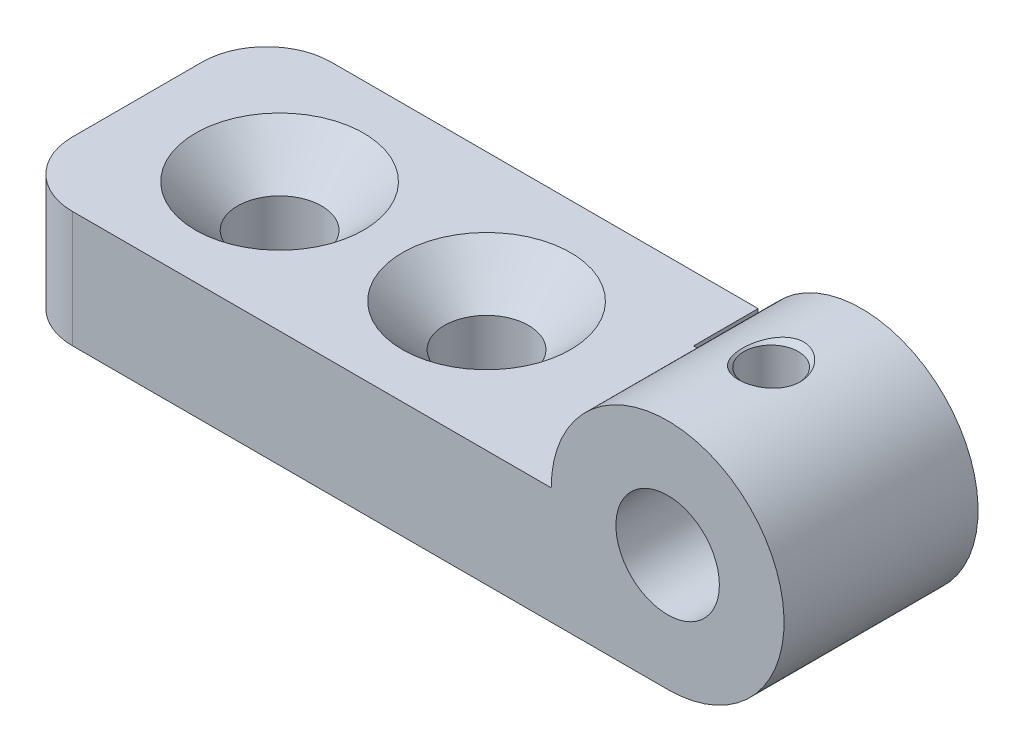
ISO-10303-21;
HEADER;
FILE_DESCRIPTION(('STEP AP214'),'2;1');
FILE_NAME('part.step','',(''),(''),'','','');
FILE_SCHEMA(('AUTOMOTIVE_DESIGN { 1 0 10303 214 1 1 1 1 }'));
ENDSEC;
DATA;
#1=APPLICATION_CONTEXT('core data for automotive mechanical design processes');
#2=APPLICATION_PROTOCOL_DEFINITION('international standard','automotive_design',2000,#1);
#3=PRODUCT_CONTEXT('',#1,'mechanical');
#4=PRODUCT('Part','Part','',(#3));
#5=PRODUCT_RELATED_PRODUCT_CATEGORY('part','',(#4));
#6=PRODUCT_DEFINITION_FORMATION('','',#4);
#7=PRODUCT_DEFINITION_CONTEXT('part definition',#1,'design');
#8=PRODUCT_DEFINITION('design','',#6,#7);
#9=PRODUCT_DEFINITION_SHAPE('','',#8);
#10=(LENGTH_UNIT() NAMED_UNIT(*) SI_UNIT(.MILLI.,.METRE.));
#11=(NAMED_UNIT(*) PLANE_ANGLE_UNIT() SI_UNIT($,.RADIAN.));
#12=(NAMED_UNIT(*) SI_UNIT($,.STERADIAN.) SOLID_ANGLE_UNIT());
#13=UNCERTAINTY_MEASURE_WITH_UNIT(LENGTH_MEASURE(1.E-05),#10,'distance_accuracy_value','');
#14=(GEOMETRIC_REPRESENTATION_CONTEXT(3) GLOBAL_UNCERTAINTY_ASSIGNED_CONTEXT((#13)) GLOBAL_UNIT_ASSIGNED_CONTEXT((#10,
#11,#12)) REPRESENTATION_CONTEXT('',''));
#15=CARTESIAN_POINT('',(0.,0.,0.));
#16=DIRECTION('',(0.,0.,1.));
#17=DIRECTION('',(1.,0.,0.));
#18=AXIS2_PLACEMENT_3D('',#15,#16,#17);
#19=CARTESIAN_POINT('',(51.,9.,10.));
#20=DIRECTION('',(0.,0.,1.));
#21=DIRECTION('',(1.,0.,0.));
#22=AXIS2_PLACEMENT_3D('',#19,#20,#21);
#23=PLANE('',#22);
#24=DIRECTION('',(-1.,0.,0.));
#25=VECTOR('',#24,1.);
#26=CARTESIAN_POINT('',(0.,9.,10.));
#27=LINE('',#26,#25);
#28=CARTESIAN_POINT('',(42.,9.,10.));
#29=VERTEX_POINT('',#28);
#30=CARTESIAN_POINT('',(5.,9.,10.));
#31=VERTEX_POINT('',#30);
#32=EDGE_CURVE('E157',#29,#31,#27,.T.);
#33=ORIENTED_EDGE('',*,*,#32,.T.);
#34=DIRECTION('',(0.,-1.,0.));
#35=VECTOR('',#34,1.);
#36=CARTESIAN_POINT('',(5.,0.,10.));
#37=LINE('',#36,#35);
#38=CARTESIAN_POINT('',(5.,0.,10.));
#39=VERTEX_POINT('',#38);
#40=EDGE_CURVE('E12',#31,#39,#37,.T.);
#41=ORIENTED_EDGE('',*,*,#40,.T.);
#42=DIRECTION('',(1.,0.,0.));
#43=VECTOR('',#42,1.);
#44=CARTESIAN_POINT('',(0.,0.,10.));
#45=LINE('',#44,#43);
#46=CARTESIAN_POINT('',(51.,0.,10.));
#47=VERTEX_POINT('',#46);
#48=EDGE_CURVE('E152',#39,#47,#45,.T.);
#49=ORIENTED_EDGE('',*,*,#48,.T.);
#50=CARTESIAN_POINT('',(51.,9.,10.));
#51=DIRECTION('',(0.,0.,1.));
#52=DIRECTION('',(1.,0.,0.));
#53=AXIS2_PLACEMENT_3D('',#50,#51,#52);
#54=CIRCLE('',#53,9.);
#55=EDGE_CURVE('E154',#47,#29,#54,.T.);
#56=ORIENTED_EDGE('',*,*,#55,.T.);
#57=EDGE_LOOP('',(#33,#41,#49,#56));
#58=FACE_BOUND('',#57,.T.);
#59=CARTESIAN_POINT('',(51.,9.,10.));
#60=DIRECTION('',(0.,0.,1.));
#61=DIRECTION('',(1.,0.,0.));
#62=AXIS2_PLACEMENT_3D('',#59,#60,#61);
#63=CIRCLE('',#62,4.);
#64=CARTESIAN_POINT('',(55.,9.,10.));
#65=VERTEX_POINT('',#64);
#66=EDGE_CURVE('E148',#65,#65,#63,.T.);
#67=ORIENTED_EDGE('',*,*,#66,.F.);
#68=EDGE_LOOP('',(#67));
#69=FACE_BOUND('',#68,.T.);
#70=ADVANCED_FACE('F47',(#58,#69),#23,.T.);
#71=CARTESIAN_POINT('',(51.,9.,-10.));
#72=DIRECTION('',(0.,0.,1.));
#73=DIRECTION('',(1.,0.,0.));
#74=AXIS2_PLACEMENT_3D('',#71,#72,#73);
#75=PLANE('',#74);
#76=DIRECTION('',(1.,0.,0.));
#77=VECTOR('',#76,1.);
#78=CARTESIAN_POINT('',(0.,0.,-10.));
#79=LINE('',#78,#77);
#80=CARTESIAN_POINT('',(5.,0.,-10.));
#81=VERTEX_POINT('',#80);
#82=CARTESIAN_POINT('',(38.,0.,-10.));
#83=VERTEX_POINT('',#82);
#84=EDGE_CURVE('E151',#81,#83,#79,.T.);
#85=ORIENTED_EDGE('',*,*,#84,.F.);
#86=DIRECTION('',(0.,-1.,0.));
#87=VECTOR('',#86,1.);
#88=CARTESIAN_POINT('',(5.,9.,-10.));
#89=LINE('',#88,#87);
#90=CARTESIAN_POINT('',(5.,9.,-10.));
#91=VERTEX_POINT('',#90);
#92=EDGE_CURVE('E70',#81,#91,#89,.F.);
#93=ORIENTED_EDGE('',*,*,#92,.T.);
#94=DIRECTION('',(-1.,0.,0.));
#95=VECTOR('',#94,1.);
#96=CARTESIAN_POINT('',(0.,9.,-10.));
#97=LINE('',#96,#95);
#98=CARTESIAN_POINT('',(38.,9.,-10.));
#99=VERTEX_POINT('',#98);
#100=EDGE_CURVE('E155',#99,#91,#97,.T.);
#101=ORIENTED_EDGE('',*,*,#100,.F.);
#102=DIRECTION('',(0.,-1.,0.));
#103=VECTOR('',#102,1.);
#104=CARTESIAN_POINT('',(38.,102.446411113868,-10.));
#105=LINE('',#104,#103);
#106=EDGE_CURVE('E123',#99,#83,#105,.T.);
#107=ORIENTED_EDGE('',*,*,#106,.T.);
#108=EDGE_LOOP('',(#85,#93,#101,#107));
#109=FACE_BOUND('',#108,.T.);
#110=ADVANCED_FACE('F253',(#109),#75,.F.);
#111=CARTESIAN_POINT('',(0.,0.,10.));
#112=DIRECTION('',(1.,0.,0.));
#113=DIRECTION('',(0.,0.,-1.));
#114=AXIS2_PLACEMENT_3D('',#111,#112,#113);
#115=PLANE('',#114);
#116=DIRECTION('',(0.,0.,-1.));
#117=VECTOR('',#116,1.);
#118=CARTESIAN_POINT('',(0.,9.,10.));
#119=LINE('',#118,#117);
#120=CARTESIAN_POINT('',(0.,9.,5.));
#121=VERTEX_POINT('',#120);
#122=CARTESIAN_POINT('',(0.,9.,-5.));
#123=VERTEX_POINT('',#122);
#124=EDGE_CURVE('E159',#121,#123,#119,.T.);
#125=ORIENTED_EDGE('',*,*,#124,.T.);
#126=DIRECTION('',(0.,-1.,0.));
#127=VECTOR('',#126,1.);
#128=CARTESIAN_POINT('',(0.,0.,-5.));
#129=LINE('',#128,#127);
#130=CARTESIAN_POINT('',(0.,0.,-5.));
#131=VERTEX_POINT('',#130);
#132=EDGE_CURVE('E292',#123,#131,#129,.T.);
#133=ORIENTED_EDGE('',*,*,#132,.T.);
#134=DIRECTION('',(0.,0.,-1.));
#135=VECTOR('',#134,1.);
#136=CARTESIAN_POINT('',(0.,0.,10.));
#137=LINE('',#136,#135);
#138=CARTESIAN_POINT('',(0.,0.,5.));
#139=VERTEX_POINT('',#138);
#140=EDGE_CURVE('E168',#139,#131,#137,.T.);
#141=ORIENTED_EDGE('',*,*,#140,.F.);
#142=DIRECTION('',(0.,-1.,0.));
#143=VECTOR('',#142,1.);
#144=CARTESIAN_POINT('',(0.,9.,5.));
#145=LINE('',#144,#143);
#146=EDGE_CURVE('E188',#139,#121,#145,.F.);
#147=ORIENTED_EDGE('',*,*,#146,.T.);
#148=EDGE_LOOP('',(#125,#133,#141,#147));
#149=FACE_BOUND('',#148,.T.);
#150=ADVANCED_FACE('F260',(#149),#115,.F.);
#151=CARTESIAN_POINT('',(0.,0.,10.));
#152=DIRECTION('',(0.,1.,0.));
#153=DIRECTION('',(0.,0.,1.));
#154=AXIS2_PLACEMENT_3D('',#151,#152,#153);
#155=PLANE('',#154);
#156=CARTESIAN_POINT('',(11.,0.,0.));
#157=DIRECTION('',(0.,1.,0.));
#158=DIRECTION('',(0.,0.,1.));
#159=AXIS2_PLACEMENT_3D('',#156,#157,#158);
#160=CIRCLE('',#159,3.24999999999999);
#161=CARTESIAN_POINT('',(11.,0.,3.24999999999999));
#162=VERTEX_POINT('',#161);
#163=EDGE_CURVE('E176',#162,#162,#160,.T.);
#164=ORIENTED_EDGE('',*,*,#163,.T.);
#165=EDGE_LOOP('',(#164));
#166=FACE_BOUND('',#165,.T.);
#167=CARTESIAN_POINT('',(27.,0.,0.));
#168=DIRECTION('',(0.,1.,0.));
#169=DIRECTION('',(0.,0.,1.));
#170=AXIS2_PLACEMENT_3D('',#167,#168,#169);
#171=CIRCLE('',#170,3.24999999999999);
#172=CARTESIAN_POINT('',(27.,0.,3.24999999999999));
#173=VERTEX_POINT('',#172);
#174=EDGE_CURVE('E135',#173,#173,#171,.T.);
#175=ORIENTED_EDGE('',*,*,#174,.T.);
#176=EDGE_LOOP('',(#175));
#177=FACE_BOUND('',#176,.T.);
#178=ORIENTED_EDGE('',*,*,#140,.T.);
#179=CARTESIAN_POINT('',(5.,0.,-5.));
#180=DIRECTION('',(0.,1.,0.));
#181=DIRECTION('',(0.,0.,1.));
#182=AXIS2_PLACEMENT_3D('',#179,#180,#181);
#183=CIRCLE('',#182,5.);
#184=EDGE_CURVE('E285',#131,#81,#183,.F.);
#185=ORIENTED_EDGE('',*,*,#184,.T.);
#186=ORIENTED_EDGE('',*,*,#84,.T.);
#187=DIRECTION('',(0.,0.,1.));
#188=VECTOR('',#187,1.);
#189=CARTESIAN_POINT('',(38.,0.,10.));
#190=LINE('',#189,#188);
#191=CARTESIAN_POINT('',(38.,0.,-5.));
#192=VERTEX_POINT('',#191);
#193=EDGE_CURVE('E146',#83,#192,#190,.T.);
#194=ORIENTED_EDGE('',*,*,#193,.T.);
#195=DIRECTION('',(1.,0.,0.));
#196=VECTOR('',#195,1.);
#197=CARTESIAN_POINT('',(0.,0.,-4.99999999999999));
#198=LINE('',#197,#196);
#199=CARTESIAN_POINT('',(51.,0.,-5.));
#200=VERTEX_POINT('',#199);
#201=EDGE_CURVE('E134',#192,#200,#198,.T.);
#202=ORIENTED_EDGE('',*,*,#201,.T.);
#203=DIRECTION('',(0.,0.,-1.));
#204=VECTOR('',#203,1.);
#205=CARTESIAN_POINT('',(51.,0.,10.));
#206=LINE('',#205,#204);
#207=EDGE_CURVE('E165',#47,#200,#206,.T.);
#208=ORIENTED_EDGE('',*,*,#207,.F.);
#209=ORIENTED_EDGE('',*,*,#48,.F.);
#210=CARTESIAN_POINT('',(5.,0.,5.));
#211=DIRECTION('',(0.,1.,0.));
#212=DIRECTION('',(0.,0.,1.));
#213=AXIS2_PLACEMENT_3D('',#210,#211,#212);
#214=CIRCLE('',#213,5.);
#215=EDGE_CURVE('E287',#39,#139,#214,.F.);
#216=ORIENTED_EDGE('',*,*,#215,.T.);
#217=EDGE_LOOP('',(#178,#185,#186,#194,#202,#208,#209,#216));
#218=FACE_BOUND('',#217,.T.);
#219=ADVANCED_FACE('F248',(#166,#177,#218),#155,.F.);
#220=CARTESIAN_POINT('',(51.,9.,10.));
#221=DIRECTION('',(0.,0.,-1.));
#222=DIRECTION('',(-1.,0.,0.));
#223=AXIS2_PLACEMENT_3D('',#220,#221,#222);
#224=CYLINDRICAL_SURFACE('',#223,9.);
#225=CARTESIAN_POINT('',(49.3462036491435,17.8467484245641,0.299956412959675));
#226=CARTESIAN_POINT('',(49.419666860992,17.860480430943,0.209329528892533));
#227=CARTESIAN_POINT('',(49.4995442844583,17.8744685639425,0.123964784392771));
#228=CARTESIAN_POINT('',(49.6712422594437,17.9017951390538,-0.0339996371980781));
#229=CARTESIAN_POINT('',(49.763064322323,17.9151334986553,-0.106597696176441));
#230=CARTESIAN_POINT('',(49.970579705807,17.9416243745104,-0.24543084855086));
#231=CARTESIAN_POINT('',(50.0878203025243,17.9545020599047,-0.309438305274103));
#232=CARTESIAN_POINT('',(50.3327084270864,17.9760659912661,-0.414048612138019));
#233=CARTESIAN_POINT('',(50.4603492095694,17.9847549290734,-0.454666496534323));
#234=CARTESIAN_POINT('',(50.7055914591238,17.9959177132663,-0.506408804402707));
#235=CARTESIAN_POINT('',(50.822540295189,17.9990160945853,-0.520505928603019));
#236=CARTESIAN_POINT('',(51.0570814188124,18.0005813757861,-0.527656479478852));
#237=CARTESIAN_POINT('',(51.1746733418193,17.9990506731152,-0.520720799242695));
#238=CARTESIAN_POINT('',(51.3981835994773,17.9918331397955,-0.487513845952696));
#239=CARTESIAN_POINT('',(51.5043305503991,17.9864553694951,-0.46267944342727));
#240=CARTESIAN_POINT('',(51.7111094902603,17.9724617891767,-0.396534136028166));
#241=CARTESIAN_POINT('',(51.8117408008525,17.9638455818954,-0.355221209673775));
#242=CARTESIAN_POINT('',(52.0091755721407,17.9438142231224,-0.255925401226335));
#243=CARTESIAN_POINT('',(52.1056657822736,17.93230105508,-0.19734280527394));
#244=CARTESIAN_POINT('',(52.2886059884232,17.9077511506302,-0.0664669081333771));
#245=CARTESIAN_POINT('',(52.3750520154777,17.8947138160027,0.00583178346489373));
#246=CARTESIAN_POINT('',(52.5459287489406,17.8667039265776,0.17084872750296));
#247=CARTESIAN_POINT('',(52.6290100548762,17.8516800087823,0.264954525269383));
#248=CARTESIAN_POINT('',(52.7801750171529,17.8225231459731,0.464639902316079));
#249=CARTESIAN_POINT('',(52.8482512559906,17.8083906440686,0.570225117916745));
#250=CARTESIAN_POINT('',(52.975796619898,17.7807172111898,0.803333483357477));
#251=CARTESIAN_POINT('',(53.0332884535333,17.7674450572879,0.931973448878179));
#252=CARTESIAN_POINT('',(53.1278038109325,17.7449879881691,1.1969021648288));
#253=CARTESIAN_POINT('',(53.1648207483194,17.735804388346,1.33319336099956));
#254=CARTESIAN_POINT('',(53.2196768241311,17.7220358938998,1.61947954015347));
#255=CARTESIAN_POINT('',(53.2360415537329,17.7178059714307,1.76977633918436));
#256=CARTESIAN_POINT('',(53.2445569761319,17.7156170099676,2.0711059470346));
#257=CARTESIAN_POINT('',(53.2367042937605,17.7176588450652,2.22213885551629));
#258=CARTESIAN_POINT('',(53.1965665591249,17.7278594807905,2.52338192345887));
#259=CARTESIAN_POINT('',(53.1638628994054,17.7361230628035,2.67353307711686));
#260=CARTESIAN_POINT('',(53.0740476148241,17.7578791802476,2.96600065579078));
#261=CARTESIAN_POINT('',(53.016931681172,17.7713726387178,3.10831569271651));
#262=CARTESIAN_POINT('',(52.879847003673,17.8017635819295,3.37935519507102));
#263=CARTESIAN_POINT('',(52.8001080350737,17.8186263604498,3.50819932985354));
#264=CARTESIAN_POINT('',(52.6187690105762,17.8537045486857,3.74935941371746));
#265=CARTESIAN_POINT('',(52.5171728209955,17.8719197188044,3.86167828003958));
#266=CARTESIAN_POINT('',(52.3010770378205,17.9060869276666,4.05842413334239));
#267=CARTESIAN_POINT('',(52.1877842653415,17.9221092568933,4.14415750675765));
#268=CARTESIAN_POINT('',(51.9464393983414,17.9509176159356,4.29220170780316));
#269=CARTESIAN_POINT('',(51.8184063727439,17.9637077601317,4.35454236252462));
#270=CARTESIAN_POINT('',(51.5690728181203,17.9827457747004,4.44543436808582));
#271=CARTESIAN_POINT('',(51.4490300015802,17.9896242152097,4.47730416670889));
#272=CARTESIAN_POINT('',(51.2049575480994,17.9984913164323,4.51818464297099));
#273=CARTESIAN_POINT('',(51.0809312480175,18.0004839669202,4.52721397250794));
#274=CARTESIAN_POINT('',(50.8468587037414,17.9993758818126,4.5221467917091));
#275=CARTESIAN_POINT('',(50.7367499645998,17.9968022473398,4.51044372425196));
#276=CARTESIAN_POINT('',(50.5201435133777,17.9878521196141,4.46906802812115));
#277=CARTESIAN_POINT('',(50.413645695361,17.9814757380275,4.43939592710068));
#278=CARTESIAN_POINT('',(50.2071056010614,17.9656040518925,4.36356976480584));
#279=CARTESIAN_POINT('',(50.1070573703795,17.9561116749019,4.3174311706898));
#280=CARTESIAN_POINT('',(49.9153517898195,17.9349233561298,4.2105884465053));
#281=CARTESIAN_POINT('',(49.8236969563447,17.923226756699,4.14987996789975));
#282=CARTESIAN_POINT('',(49.6420696185414,17.8974839646173,4.00963785114961));
#283=CARTESIAN_POINT('',(49.55306929054,17.8833202287074,3.92886943657905));
#284=CARTESIAN_POINT('',(49.3881404063773,17.8548815374204,3.7549706861893));
#285=CARTESIAN_POINT('',(49.3122183027446,17.8406065307543,3.66183428816102));
#286=CARTESIAN_POINT('',(49.1656858899562,17.8114449496761,3.45334591159253));
#287=CARTESIAN_POINT('',(49.0969243504794,17.7967047952156,3.33667217661535));
#288=CARTESIAN_POINT('',(48.9778912582208,17.7701084473545,3.09394338802472));
#289=CARTESIAN_POINT('',(48.927627216221,17.7582534261027,2.96788454857695));
#290=CARTESIAN_POINT('',(48.8425400411423,17.7377041971336,2.69776555728868));
#291=CARTESIAN_POINT('',(48.8095156721626,17.7293909085348,2.55310673683617));
#292=CARTESIAN_POINT('',(48.7666962618601,17.718534445945,2.26017774279638));
#293=CARTESIAN_POINT('',(48.7569053236727,17.7159922911675,2.11190693598536));
#294=CARTESIAN_POINT('',(48.760776410129,17.7169886219278,1.81087032173856));
#295=CARTESIAN_POINT('',(48.7752080044579,17.7207266373296,1.65811440107259));
#296=CARTESIAN_POINT('',(48.8287762333077,17.7342166573906,1.35722346924862));
#297=CARTESIAN_POINT('',(48.8679184792786,17.7439700280428,1.20908951569638));
#298=CARTESIAN_POINT('',(48.9684875345842,17.7678685285234,0.926806708571169));
#299=CARTESIAN_POINT('',(49.0290916071433,17.7818490476461,0.792350594481753));
#300=CARTESIAN_POINT('',(49.1718417565386,17.8126697793829,0.535824583906964));
#301=CARTESIAN_POINT('',(49.2539670136081,17.8295072226662,0.413742873762052));
#302=CARTESIAN_POINT('',(49.3462036491435,17.8467484245641,0.299956412959675));
#303=B_SPLINE_CURVE_WITH_KNOTS('',3,(#225,#226,#227,#228,#229,#230,#231,#232,#233,#234,#235,
#236,#237,#238,#239,#240,#241,#242,#243,#244,#245,#246,#247,#248,#249,#250,#251,#252,#253,#254,
#255,#256,#257,#258,#259,#260,#261,#262,#263,#264,#265,#266,#267,#268,#269,#270,#271,#272,#273,
#274,#275,#276,#277,#278,#279,#280,#281,#282,#283,#284,#285,#286,#287,#288,#289,#290,#291,#292,
#293,#294,#295,#296,#297,#298,#299,#300,#301,#302),.UNSPECIFIED.,.T.,.F.,(4,2,2,2,2,2,2,2,2,2,2,
2,2,2,2,2,2,2,2,2,2,2,2,2,2,2,2,2,2,2,2,2,2,2,2,2,2,2,4),(0.,0.352037923923102,
0.704120434761647,1.10434857169374,1.50431916359952,1.85592019187671,2.20733915376105,
2.53330469796777,2.85931024186281,3.19833201823537,3.53748730682384,3.91524695523001,
4.29319292605416,4.71594695211962,5.13883689097829,5.59046853672724,6.04216312899562,
6.50163983900831,6.96119768062488,7.41624548541254,7.87121286301124,8.29768264883909,
8.72360679782701,9.09465793395586,9.46540596574061,9.79609272008231,10.1267697644154,
10.4571370141391,10.7876029883746,11.1492056390729,11.5109861892949,11.9179671510203,
12.3251131827179,12.7689346656735,13.212834523805,13.6711059666551,14.129481514111,
14.5719086874088,15.0139094231038),.UNSPECIFIED.);
#304=CARTESIAN_POINT('',(49.3462036491435,17.8467484245641,0.299956412959675));
#305=VERTEX_POINT('',#304);
#306=EDGE_CURVE('E125',#305,#305,#303,.T.);
#307=ORIENTED_EDGE('',*,*,#306,.T.);
#308=EDGE_LOOP('',(#307));
#309=FACE_BOUND('',#308,.T.);
#310=CARTESIAN_POINT('',(51.,9.,-5.));
#311=DIRECTION('',(0.,0.,1.));
#312=DIRECTION('',(1.,0.,0.));
#313=AXIS2_PLACEMENT_3D('',#310,#311,#312);
#314=CIRCLE('',#313,9.);
#315=CARTESIAN_POINT('',(42.,9.,-5.));
#316=VERTEX_POINT('',#315);
#317=EDGE_CURVE('E140',#200,#316,#314,.T.);
#318=ORIENTED_EDGE('',*,*,#317,.T.);
#319=DIRECTION('',(0.,0.,-1.));
#320=VECTOR('',#319,1.);
#321=CARTESIAN_POINT('',(42.,9.,10.));
#322=LINE('',#321,#320);
#323=EDGE_CURVE('E139',#29,#316,#322,.T.);
#324=ORIENTED_EDGE('',*,*,#323,.F.);
#325=ORIENTED_EDGE('',*,*,#55,.F.);
#326=ORIENTED_EDGE('',*,*,#207,.T.);
#327=EDGE_LOOP('',(#318,#324,#325,#326));
#328=FACE_BOUND('',#327,.T.);
#329=ADVANCED_FACE('F190',(#309,#328),#224,.T.);
#330=CARTESIAN_POINT('',(0.,9.,10.));
#331=DIRECTION('',(0.,-1.,0.));
#332=DIRECTION('',(0.,0.,-1.));
#333=AXIS2_PLACEMENT_3D('',#330,#331,#332);
#334=PLANE('',#333);
#335=CARTESIAN_POINT('',(11.,9.,0.));
#336=DIRECTION('',(0.,1.,0.));
#337=DIRECTION('',(0.,0.,1.));
#338=AXIS2_PLACEMENT_3D('',#335,#336,#337);
#339=CIRCLE('',#338,6.5);
#340=CARTESIAN_POINT('',(11.,9.,6.5));
#341=VERTEX_POINT('',#340);
#342=EDGE_CURVE('E216',#341,#341,#339,.T.);
#343=ORIENTED_EDGE('',*,*,#342,.F.);
#344=EDGE_LOOP('',(#343));
#345=FACE_BOUND('',#344,.T.);
#346=CARTESIAN_POINT('',(27.,9.,0.));
#347=DIRECTION('',(0.,1.,0.));
#348=DIRECTION('',(0.,0.,1.));
#349=AXIS2_PLACEMENT_3D('',#346,#347,#348);
#350=CIRCLE('',#349,6.5);
#351=CARTESIAN_POINT('',(27.,9.,6.5));
#352=VERTEX_POINT('',#351);
#353=EDGE_CURVE('E179',#352,#352,#350,.T.);
#354=ORIENTED_EDGE('',*,*,#353,.F.);
#355=EDGE_LOOP('',(#354));
#356=FACE_BOUND('',#355,.T.);
#357=ORIENTED_EDGE('',*,*,#100,.T.);
#358=CARTESIAN_POINT('',(5.,9.,-5.));
#359=DIRECTION('',(0.,-1.,0.));
#360=DIRECTION('',(0.,0.,-1.));
#361=AXIS2_PLACEMENT_3D('',#358,#359,#360);
#362=CIRCLE('',#361,5.);
#363=EDGE_CURVE('E55',#91,#123,#362,.F.);
#364=ORIENTED_EDGE('',*,*,#363,.T.);
#365=ORIENTED_EDGE('',*,*,#124,.F.);
#366=CARTESIAN_POINT('',(5.,9.,5.));
#367=DIRECTION('',(0.,-1.,0.));
#368=DIRECTION('',(0.,0.,-1.));
#369=AXIS2_PLACEMENT_3D('',#366,#367,#368);
#370=CIRCLE('',#369,5.);
#371=EDGE_CURVE('E62',#121,#31,#370,.F.);
#372=ORIENTED_EDGE('',*,*,#371,.T.);
#373=ORIENTED_EDGE('',*,*,#32,.F.);
#374=ORIENTED_EDGE('',*,*,#323,.T.);
#375=DIRECTION('',(-1.,0.,0.));
#376=VECTOR('',#375,1.);
#377=CARTESIAN_POINT('',(0.,9.,-4.99999999999999));
#378=LINE('',#377,#376);
#379=CARTESIAN_POINT('',(38.,8.99999999999999,-5.));
#380=VERTEX_POINT('',#379);
#381=EDGE_CURVE('E131',#316,#380,#378,.T.);
#382=ORIENTED_EDGE('',*,*,#381,.T.);
#383=DIRECTION('',(0.,0.,-1.));
#384=VECTOR('',#383,1.);
#385=CARTESIAN_POINT('',(38.,9.,10.));
#386=LINE('',#385,#384);
#387=EDGE_CURVE('E116',#380,#99,#386,.T.);
#388=ORIENTED_EDGE('',*,*,#387,.T.);
#389=EDGE_LOOP('',(#357,#364,#365,#372,#373,#374,#382,#388));
#390=FACE_BOUND('',#389,.T.);
#391=ADVANCED_FACE('F137',(#345,#356,#390),#334,.F.);
#392=CARTESIAN_POINT('',(51.,9.,10.));
#393=DIRECTION('',(0.,0.,-1.));
#394=DIRECTION('',(-1.,0.,0.));
#395=AXIS2_PLACEMENT_3D('',#392,#393,#394);
#396=CYLINDRICAL_SURFACE('',#395,4.);
#397=CARTESIAN_POINT('',(51.,13.,4.1));
#398=CARTESIAN_POINT('',(50.8902747604778,12.9999926428786,4.09999149182402));
#399=CARTESIAN_POINT('',(50.780433878202,12.9954373562782,4.09134922217853));
#400=CARTESIAN_POINT('',(50.5640436671467,12.9776605655973,4.05717948516372));
#401=CARTESIAN_POINT('',(50.4575000329738,12.9644248587299,4.03162434455593));
#402=CARTESIAN_POINT('',(50.2511522327434,12.9306635626211,3.96492682041999));
#403=CARTESIAN_POINT('',(50.151322911508,12.9101672216118,3.92384693196483));
#404=CARTESIAN_POINT('',(49.9601457073983,12.8637281483345,3.82761268027));
#405=CARTESIAN_POINT('',(49.8687976926564,12.8377855007663,3.77245853590725));
#406=CARTESIAN_POINT('',(49.690528171083,12.780819630101,3.64560480379001));
#407=CARTESIAN_POINT('',(49.6042757208411,12.7495762633363,3.57306544943579));
#408=CARTESIAN_POINT('',(49.4445349499287,12.6861806966524,3.41532568390628));
#409=CARTESIAN_POINT('',(49.3710574345764,12.6540277538604,3.33011466668524));
#410=CARTESIAN_POINT('',(49.2324678927961,12.5891760227479,3.14052416418154));
#411=CARTESIAN_POINT('',(49.168654030502,12.5566765113324,3.03511911137417));
#412=CARTESIAN_POINT('',(49.059921990478,12.4985599220822,2.81322101259495));
#413=CARTESIAN_POINT('',(49.0149894401638,12.4729376146597,2.69673648353418));
#414=CARTESIAN_POINT('',(48.9483722102668,12.4339831229548,2.46326910199041));
#415=CARTESIAN_POINT('',(48.9254186662482,12.4199873312242,2.34676509569802));
#416=CARTESIAN_POINT('',(48.8995793422591,12.4041872198482,2.11079196134465));
#417=CARTESIAN_POINT('',(48.8966697439273,12.402368430258,1.99132652193648));
#418=CARTESIAN_POINT('',(48.9100742431325,12.4106056313839,1.77023585900602));
#419=CARTESIAN_POINT('',(48.9238424799797,12.4190893964975,1.66838235315367));
#420=CARTESIAN_POINT('',(48.9657551799458,12.4441891657529,1.46871985136042));
#421=CARTESIAN_POINT('',(48.9939050885457,12.460808250155,1.37091240259462));
#422=CARTESIAN_POINT('',(49.0642379827497,12.5006401733788,1.17933944133553));
#423=CARTESIAN_POINT('',(49.1067261348403,12.523994639943,1.08571682638859));
#424=CARTESIAN_POINT('',(49.204283332447,12.5746917771419,0.906461254459914));
#425=CARTESIAN_POINT('',(49.2593579969565,12.6020362270467,0.820831890023035));
#426=CARTESIAN_POINT('',(49.3896060181948,12.6623044440403,0.647219577590176));
#427=CARTESIAN_POINT('',(49.4665215749829,12.695469728309,0.560622730534307));
#428=CARTESIAN_POINT('',(49.6338353721882,12.7605392698717,0.400945079493351));
#429=CARTESIAN_POINT('',(49.7242413144175,12.7924427935636,0.327872050145727));
#430=CARTESIAN_POINT('',(49.92233195967,12.853563532607,0.193417879315355));
#431=CARTESIAN_POINT('',(50.0307010805565,12.8825299847447,0.132921531188313));
#432=CARTESIAN_POINT('',(50.2579765578151,12.9322877259573,0.0315373292850103));
#433=CARTESIAN_POINT('',(50.3768736592161,12.9530861097046,-0.00936754818650169));
#434=CARTESIAN_POINT('',(50.6106030253733,12.9825873442618,-0.0667726791061422));
#435=CARTESIAN_POINT('',(50.7248691769058,12.992195077283,-0.0851069092832008));
#436=CARTESIAN_POINT('',(50.9552391333249,13.0014066976739,-0.102693149009141));
#437=CARTESIAN_POINT('',(51.0713418920739,13.0010160886439,-0.101955656610071));
#438=CARTESIAN_POINT('',(51.291279078553,12.9907672868362,-0.0823727421171214));
#439=CARTESIAN_POINT('',(51.395299675486,12.9817385949971,-0.065113770450324));
#440=CARTESIAN_POINT('',(51.5987281821962,12.9562654752731,-0.0155612495609097));
#441=CARTESIAN_POINT('',(51.6981356040427,12.9398202649135,0.0167338860533488));
#442=CARTESIAN_POINT('',(51.8925533273277,12.9004422108233,0.0961442538187328));
#443=CARTESIAN_POINT('',(51.9873820333791,12.8773517638823,0.143623074267309));
#444=CARTESIAN_POINT('',(52.1680115660273,12.8268210303281,0.25161917503482));
#445=CARTESIAN_POINT('',(52.2538087513307,12.7993790003517,0.312141684516997));
#446=CARTESIAN_POINT('',(52.4235540216476,12.7393084994505,0.451834553891365));
#447=CARTESIAN_POINT('',(52.5063537523617,12.7064382452969,0.53229813881505));
#448=CARTESIAN_POINT('',(52.6578494546286,12.6412020641859,0.705851378857229));
#449=CARTESIAN_POINT('',(52.7265331945546,12.6088365968813,0.798951868958983));
#450=CARTESIAN_POINT('',(52.851974077132,12.5461829127588,1.00233559015911));
#451=CARTESIAN_POINT('',(52.907720584217,12.5161500347792,1.1133282356271));
#452=CARTESIAN_POINT('',(52.9991637743397,12.4649855830167,1.34516122596433));
#453=CARTESIAN_POINT('',(53.0348884741635,12.4438415813214,1.46598753776113));
#454=CARTESIAN_POINT('',(53.0817922879402,12.415673357382,1.70149049526115));
#455=CARTESIAN_POINT('',(53.0950321279794,12.4074693970288,1.81561103123257));
#456=CARTESIAN_POINT('',(53.102644024987,12.4027813251837,2.04469308443813));
#457=CARTESIAN_POINT('',(53.0970275535202,12.4062900880456,2.15965404791749));
#458=CARTESIAN_POINT('',(53.0690573196641,12.4233328006087,2.37316961432222));
#459=CARTESIAN_POINT('',(53.0486958657845,12.4356715106149,2.47209433551285));
#460=CARTESIAN_POINT('',(52.9944595344747,12.4674360798436,2.66496081401225));
#461=CARTESIAN_POINT('',(52.9605798567634,12.4868644563759,2.75890078781238));
#462=CARTESIAN_POINT('',(52.8778270800915,12.5321553950175,2.94599660125696));
#463=CARTESIAN_POINT('',(52.8281169720611,12.5583561513698,3.03869769157732));
#464=CARTESIAN_POINT('',(52.7159718914852,12.6137728301922,3.21506230921822));
#465=CARTESIAN_POINT('',(52.6535300748842,12.6429903701767,3.29872093850826));
#466=CARTESIAN_POINT('',(52.5075649936158,12.7059946066124,3.46672364713411));
#467=CARTESIAN_POINT('',(52.4223189868045,12.7398529843817,3.54955350976633));
#468=CARTESIAN_POINT('',(52.2383912708079,12.8047226129078,3.70015739194561));
#469=CARTESIAN_POINT('',(52.1397013444633,12.8357321028129,3.76792213623382));
#470=CARTESIAN_POINT('',(51.9287225864108,12.8922446343073,3.88743364904117));
#471=CARTESIAN_POINT('',(51.8162064746363,12.9176287647099,3.93884301060635));
#472=CARTESIAN_POINT('',(51.6411017995117,12.9487374572772,4.00070791315573));
#473=CARTESIAN_POINT('',(51.5817183210495,12.9579421217688,4.01878135698884));
#474=CARTESIAN_POINT('',(51.4612728451806,12.973777076514,4.04965439112677));
#475=CARTESIAN_POINT('',(51.4002118242863,12.98040883185,4.06245698304871));
#476=CARTESIAN_POINT('',(51.2827771772,12.9903853496153,4.08164251076547));
#477=CARTESIAN_POINT('',(51.2265047460104,12.9939811717507,4.08851710911178));
#478=CARTESIAN_POINT('',(51.1134985326049,12.998790423324,4.09769809925703));
#479=CARTESIAN_POINT('',(51.0567647413745,13.0000038060987,4.1000044015799));
#480=CARTESIAN_POINT('',(51.,13.,4.1));
#481=B_SPLINE_CURVE_WITH_KNOTS('',3,(#397,#398,#399,#400,#401,#402,#403,#404,#405,#406,#407,
#408,#409,#410,#411,#412,#413,#414,#415,#416,#417,#418,#419,#420,#421,#422,#423,#424,#425,#426,
#427,#428,#429,#430,#431,#432,#433,#434,#435,#436,#437,#438,#439,#440,#441,#442,#443,#444,#445,
#446,#447,#448,#449,#450,#451,#452,#453,#454,#455,#456,#457,#458,#459,#460,#461,#462,#463,#464,
#465,#466,#467,#468,#469,#470,#471,#472,#473,#474,#475,#476,#477,#478,#479,#480),.UNSPECIFIED.,
.T.,.F.,(4,2,2,2,2,2,2,2,2,2,2,2,2,2,2,2,2,2,2,2,2,2,2,2,2,2,2,2,2,2,2,2,2,2,2,2,2,2,2,2,2,4),
(0.,0.328955388056856,0.658450355809527,0.986632826787795,1.31481019432104,1.66422610127769,
2.01393612903031,2.3943054227538,2.77438464995627,3.13089429519634,3.48698022433371,
3.79492330354658,4.1029830689429,4.4180628707179,4.73328360921355,5.09317488258759,
5.45327241364168,5.83355153918035,6.21349962504738,6.55994297045684,6.90619561978193,
7.2222202700175,7.53827827001647,7.8625561182731,8.18696421086292,8.54557019619713,
8.90448561862084,9.285779463906,9.66653841880977,10.0100186118085,10.3532898805348,
10.6572136356427,10.9612454093543,11.2851996834104,11.6093285635883,11.9784125341219,
12.347723115996,12.7242211787441,12.9122308814786,13.1001333688401,13.2703102751049,
13.4404905144749),.UNSPECIFIED.);
#482=CARTESIAN_POINT('',(51.,13.,4.1));
#483=VERTEX_POINT('',#482);
#484=EDGE_CURVE('E209',#483,#483,#481,.T.);
#485=ORIENTED_EDGE('',*,*,#484,.F.);
#486=EDGE_LOOP('',(#485));
#487=FACE_BOUND('',#486,.T.);
#488=CARTESIAN_POINT('',(51.,9.,-5.));
#489=DIRECTION('',(0.,0.,1.));
#490=DIRECTION('',(1.,0.,0.));
#491=AXIS2_PLACEMENT_3D('',#488,#489,#490);
#492=CIRCLE('',#491,4.);
#493=CARTESIAN_POINT('',(55.,9.,-5.));
#494=VERTEX_POINT('',#493);
#495=EDGE_CURVE('E126',#494,#494,#492,.T.);
#496=ORIENTED_EDGE('',*,*,#495,.F.);
#497=EDGE_LOOP('',(#496));
#498=FACE_BOUND('',#497,.T.);
#499=ORIENTED_EDGE('',*,*,#66,.T.);
#500=EDGE_LOOP('',(#499));
#501=FACE_BOUND('',#500,.T.);
#502=ADVANCED_FACE('F238',(#487,#498,#501),#396,.F.);
#503=CARTESIAN_POINT('',(38.,102.446411113868,-5.));
#504=DIRECTION('',(-1.,0.,0.));
#505=DIRECTION('',(0.,0.,1.));
#506=AXIS2_PLACEMENT_3D('',#503,#504,#505);
#507=PLANE('',#506);
#508=ORIENTED_EDGE('',*,*,#193,.F.);
#509=ORIENTED_EDGE('',*,*,#106,.F.);
#510=ORIENTED_EDGE('',*,*,#387,.F.);
#511=DIRECTION('',(0.,-1.,0.));
#512=VECTOR('',#511,1.);
#513=CARTESIAN_POINT('',(38.,102.446411113868,-5.));
#514=LINE('',#513,#512);
#515=EDGE_CURVE('E120',#380,#192,#514,.T.);
#516=ORIENTED_EDGE('',*,*,#515,.T.);
#517=EDGE_LOOP('',(#508,#509,#510,#516));
#518=FACE_BOUND('',#517,.T.);
#519=ADVANCED_FACE('F119',(#518),#507,.F.);
#520=CARTESIAN_POINT('',(60.,102.446411113868,-5.));
#521=DIRECTION('',(0.,0.,1.));
#522=DIRECTION('',(1.,0.,0.));
#523=AXIS2_PLACEMENT_3D('',#520,#521,#522);
#524=PLANE('',#523);
#525=ORIENTED_EDGE('',*,*,#495,.T.);
#526=EDGE_LOOP('',(#525));
#527=FACE_BOUND('',#526,.T.);
#528=ORIENTED_EDGE('',*,*,#201,.F.);
#529=ORIENTED_EDGE('',*,*,#515,.F.);
#530=ORIENTED_EDGE('',*,*,#381,.F.);
#531=ORIENTED_EDGE('',*,*,#317,.F.);
#532=EDGE_LOOP('',(#528,#529,#530,#531));
#533=FACE_BOUND('',#532,.T.);
#534=ADVANCED_FACE('F130',(#527,#533),#524,.F.);
#535=CARTESIAN_POINT('',(27.,9.,0.));
#536=DIRECTION('',(0.,1.,0.));
#537=DIRECTION('',(0.,0.,1.));
#538=AXIS2_PLACEMENT_3D('',#535,#536,#537);
#539=CYLINDRICAL_SURFACE('',#538,3.24999999999999);
#540=CARTESIAN_POINT('',(27.,5.75,0.));
#541=DIRECTION('',(0.,1.,0.));
#542=DIRECTION('',(0.,0.,1.));
#543=AXIS2_PLACEMENT_3D('',#540,#541,#542);
#544=CIRCLE('',#543,3.25);
#545=CARTESIAN_POINT('',(27.,5.75,3.25));
#546=VERTEX_POINT('',#545);
#547=EDGE_CURVE('E175',#546,#546,#544,.T.);
#548=ORIENTED_EDGE('',*,*,#547,.T.);
#549=EDGE_LOOP('',(#548));
#550=FACE_BOUND('',#549,.T.);
#551=ORIENTED_EDGE('',*,*,#174,.F.);
#552=EDGE_LOOP('',(#551));
#553=FACE_BOUND('',#552,.T.);
#554=ADVANCED_FACE('F227',(#550,#553),#539,.F.);
#555=CARTESIAN_POINT('',(27.,9.,0.));
#556=DIRECTION('',(0.,1.,0.));
#557=DIRECTION('',(0.,0.,1.));
#558=AXIS2_PLACEMENT_3D('',#555,#556,#557);
#559=CONICAL_SURFACE('',#558,6.5,0.785398163397449);
#560=ORIENTED_EDGE('',*,*,#547,.F.);
#561=EDGE_LOOP('',(#560));
#562=FACE_BOUND('',#561,.T.);
#563=ORIENTED_EDGE('',*,*,#353,.T.);
#564=EDGE_LOOP('',(#563));
#565=FACE_BOUND('',#564,.T.);
#566=ADVANCED_FACE('F230',(#562,#565),#559,.F.);
#567=CARTESIAN_POINT('',(11.,9.,0.));
#568=DIRECTION('',(0.,1.,0.));
#569=DIRECTION('',(0.,0.,1.));
#570=AXIS2_PLACEMENT_3D('',#567,#568,#569);
#571=CYLINDRICAL_SURFACE('',#570,3.24999999999999);
#572=CARTESIAN_POINT('',(11.,5.75,0.));
#573=DIRECTION('',(0.,1.,0.));
#574=DIRECTION('',(0.,0.,1.));
#575=AXIS2_PLACEMENT_3D('',#572,#573,#574);
#576=CIRCLE('',#575,3.25);
#577=CARTESIAN_POINT('',(11.,5.75,3.25));
#578=VERTEX_POINT('',#577);
#579=EDGE_CURVE('E180',#578,#578,#576,.T.);
#580=ORIENTED_EDGE('',*,*,#579,.T.);
#581=EDGE_LOOP('',(#580));
#582=FACE_BOUND('',#581,.T.);
#583=ORIENTED_EDGE('',*,*,#163,.F.);
#584=EDGE_LOOP('',(#583));
#585=FACE_BOUND('',#584,.T.);
#586=ADVANCED_FACE('F233',(#582,#585),#571,.F.);
#587=CARTESIAN_POINT('',(11.,9.,0.));
#588=DIRECTION('',(0.,1.,0.));
#589=DIRECTION('',(0.,0.,1.));
#590=AXIS2_PLACEMENT_3D('',#587,#588,#589);
#591=CONICAL_SURFACE('',#590,6.5,0.785398163397449);
#592=ORIENTED_EDGE('',*,*,#579,.F.);
#593=EDGE_LOOP('',(#592));
#594=FACE_BOUND('',#593,.T.);
#595=ORIENTED_EDGE('',*,*,#342,.T.);
#596=EDGE_LOOP('',(#595));
#597=FACE_BOUND('',#596,.T.);
#598=ADVANCED_FACE('F199',(#594,#597),#591,.F.);
#599=CARTESIAN_POINT('',(51.,18.,2.));
#600=DIRECTION('',(0.,1.,0.));
#601=DIRECTION('',(0.,0.,1.));
#602=AXIS2_PLACEMENT_3D('',#599,#600,#601);
#603=CONICAL_SURFACE('',#602,2.525,0.785398163397444);
#604=CARTESIAN_POINT('',(51.,17.575,2.));
#605=DIRECTION('',(0.,1.,0.));
#606=DIRECTION('',(0.,0.,1.));
#607=AXIS2_PLACEMENT_3D('',#604,#605,#606);
#608=CIRCLE('',#607,2.1);
#609=CARTESIAN_POINT('',(51.,17.575,4.1));
#610=VERTEX_POINT('',#609);
#611=EDGE_CURVE('E217',#610,#610,#608,.T.);
#612=ORIENTED_EDGE('',*,*,#611,.F.);
#613=EDGE_LOOP('',(#612));
#614=FACE_BOUND('',#613,.T.);
#615=ORIENTED_EDGE('',*,*,#306,.F.);
#616=EDGE_LOOP('',(#615));
#617=FACE_BOUND('',#616,.T.);
#618=ADVANCED_FACE('F194',(#614,#617),#603,.F.);
#619=CARTESIAN_POINT('',(51.,18.,2.));
#620=DIRECTION('',(0.,1.,0.));
#621=DIRECTION('',(0.,0.,1.));
#622=AXIS2_PLACEMENT_3D('',#619,#620,#621);
#623=CYLINDRICAL_SURFACE('',#622,2.1);
#624=ORIENTED_EDGE('',*,*,#611,.T.);
#625=EDGE_LOOP('',(#624));
#626=FACE_BOUND('',#625,.T.);
#627=ORIENTED_EDGE('',*,*,#484,.T.);
#628=EDGE_LOOP('',(#627));
#629=FACE_BOUND('',#628,.T.);
#630=ADVANCED_FACE('F198',(#626,#629),#623,.F.);
#631=CARTESIAN_POINT('',(5.,0.,-5.));
#632=DIRECTION('',(0.,-1.,0.));
#633=DIRECTION('',(0.,0.,-1.));
#634=AXIS2_PLACEMENT_3D('',#631,#632,#633);
#635=CYLINDRICAL_SURFACE('',#634,5.);
#636=ORIENTED_EDGE('',*,*,#363,.F.);
#637=ORIENTED_EDGE('',*,*,#92,.F.);
#638=ORIENTED_EDGE('',*,*,#184,.F.);
#639=ORIENTED_EDGE('',*,*,#132,.F.);
#640=EDGE_LOOP('',(#636,#637,#638,#639));
#641=FACE_BOUND('',#640,.T.);
#642=ADVANCED_FACE('F204',(#641),#635,.T.);
#643=CARTESIAN_POINT('',(5.,9.,5.));
#644=DIRECTION('',(0.,1.,0.));
#645=DIRECTION('',(0.,0.,1.));
#646=AXIS2_PLACEMENT_3D('',#643,#644,#645);
#647=CYLINDRICAL_SURFACE('',#646,5.);
#648=ORIENTED_EDGE('',*,*,#371,.F.);
#649=ORIENTED_EDGE('',*,*,#146,.F.);
#650=ORIENTED_EDGE('',*,*,#215,.F.);
#651=ORIENTED_EDGE('',*,*,#40,.F.);
#652=EDGE_LOOP('',(#648,#649,#650,#651));
#653=FACE_BOUND('',#652,.T.);
#654=ADVANCED_FACE('F49',(#653),#647,.T.);
#655=CLOSED_SHELL('',(#70,#110,#150,#219,#329,#391,#502,#519,#534,#554,#566,#586,#598,#618,#630,
#642,#654));
#656=MANIFOLD_SOLID_BREP('B2',#655);
#657=ADVANCED_BREP_SHAPE_REPRESENTATION('',(#18,#656),#14);
#658=SHAPE_DEFINITION_REPRESENTATION(#9,#657);
ENDSEC;
END-ISO-10303-21;
